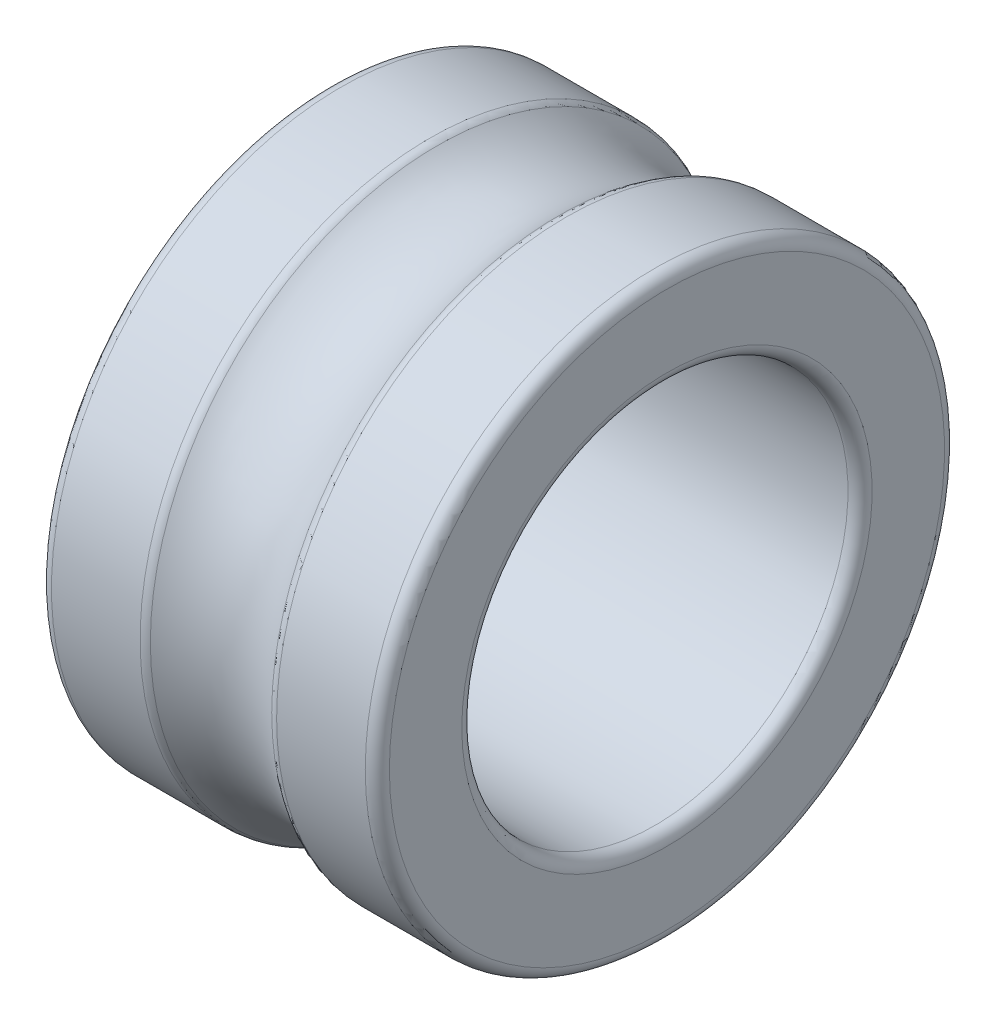
ISO-10303-21;
HEADER;
FILE_DESCRIPTION(('STEP AP214'),'2;1');
FILE_NAME('part.step','',(''),(''),'','','');
FILE_SCHEMA(('AUTOMOTIVE_DESIGN { 1 0 10303 214 1 1 1 1 }'));
ENDSEC;
DATA;
#1=APPLICATION_CONTEXT('core data for automotive mechanical design processes');
#2=APPLICATION_PROTOCOL_DEFINITION('international standard','automotive_design',2000,#1);
#3=PRODUCT_CONTEXT('',#1,'mechanical');
#4=PRODUCT('Part','Part','',(#3));
#5=PRODUCT_RELATED_PRODUCT_CATEGORY('part','',(#4));
#6=PRODUCT_DEFINITION_FORMATION('','',#4);
#7=PRODUCT_DEFINITION_CONTEXT('part definition',#1,'design');
#8=PRODUCT_DEFINITION('design','',#6,#7);
#9=PRODUCT_DEFINITION_SHAPE('','',#8);
#10=(LENGTH_UNIT() NAMED_UNIT(*) SI_UNIT(.MILLI.,.METRE.));
#11=(NAMED_UNIT(*) PLANE_ANGLE_UNIT() SI_UNIT($,.RADIAN.));
#12=(NAMED_UNIT(*) SI_UNIT($,.STERADIAN.) SOLID_ANGLE_UNIT());
#13=UNCERTAINTY_MEASURE_WITH_UNIT(LENGTH_MEASURE(1.E-05),#10,'distance_accuracy_value','');
#14=(GEOMETRIC_REPRESENTATION_CONTEXT(3) GLOBAL_UNCERTAINTY_ASSIGNED_CONTEXT((#13)) GLOBAL_UNIT_ASSIGNED_CONTEXT((#10,
#11,#12)) REPRESENTATION_CONTEXT('',''));
#15=CARTESIAN_POINT('',(0.,0.,0.));
#16=DIRECTION('',(0.,0.,1.));
#17=DIRECTION('',(1.,0.,0.));
#18=AXIS2_PLACEMENT_3D('',#15,#16,#17);
#19=CARTESIAN_POINT('',(-3.5,4.,0.));
#20=DIRECTION('',(1.,0.,0.));
#21=DIRECTION('',(0.,0.,-1.));
#22=AXIS2_PLACEMENT_3D('',#19,#20,#21);
#23=PLANE('',#22);
#24=CARTESIAN_POINT('',(-3.5,0.,0.));
#25=DIRECTION('',(1.,0.,0.));
#26=DIRECTION('',(0.,0.,-1.));
#27=AXIS2_PLACEMENT_3D('',#24,#25,#26);
#28=CIRCLE('',#27,5.75);
#29=CARTESIAN_POINT('',(-3.5,0.,-5.75));
#30=VERTEX_POINT('',#29);
#31=EDGE_CURVE('E41',#30,#30,#28,.F.);
#32=ORIENTED_EDGE('',*,*,#31,.T.);
#33=EDGE_LOOP('',(#32));
#34=FACE_BOUND('',#33,.T.);
#35=CARTESIAN_POINT('',(-3.5,0.,0.));
#36=DIRECTION('',(1.,0.,0.));
#37=DIRECTION('',(0.,0.,-1.));
#38=AXIS2_PLACEMENT_3D('',#35,#36,#37);
#39=CIRCLE('',#38,4.25);
#40=CARTESIAN_POINT('',(-3.5,0.,-4.25));
#41=VERTEX_POINT('',#40);
#42=EDGE_CURVE('E45',#41,#41,#39,.T.);
#43=ORIENTED_EDGE('',*,*,#42,.T.);
#44=EDGE_LOOP('',(#43));
#45=FACE_BOUND('',#44,.T.);
#46=ADVANCED_FACE('F31',(#34,#45),#23,.F.);
#47=CARTESIAN_POINT('',(-31.6676661264182,0.,0.));
#48=DIRECTION('',(-1.,0.,0.));
#49=DIRECTION('',(0.,0.,1.));
#50=AXIS2_PLACEMENT_3D('',#47,#48,#49);
#51=CYLINDRICAL_SURFACE('',#50,4.);
#52=CARTESIAN_POINT('',(-3.25,0.,0.));
#53=DIRECTION('',(1.,0.,0.));
#54=DIRECTION('',(0.,0.,-1.));
#55=AXIS2_PLACEMENT_3D('',#52,#53,#54);
#56=CIRCLE('',#55,4.);
#57=CARTESIAN_POINT('',(-3.25,0.,-4.));
#58=VERTEX_POINT('',#57);
#59=EDGE_CURVE('E10',#58,#58,#56,.F.);
#60=ORIENTED_EDGE('',*,*,#59,.T.);
#61=EDGE_LOOP('',(#60));
#62=FACE_BOUND('',#61,.T.);
#63=CARTESIAN_POINT('',(3.25,0.,0.));
#64=DIRECTION('',(-1.,0.,0.));
#65=DIRECTION('',(0.,0.,1.));
#66=AXIS2_PLACEMENT_3D('',#63,#64,#65);
#67=CIRCLE('',#66,4.);
#68=CARTESIAN_POINT('',(3.25,0.,4.));
#69=VERTEX_POINT('',#68);
#70=EDGE_CURVE('E37',#69,#69,#67,.F.);
#71=ORIENTED_EDGE('',*,*,#70,.T.);
#72=EDGE_LOOP('',(#71));
#73=FACE_BOUND('',#72,.T.);
#74=ADVANCED_FACE('F111',(#62,#73),#51,.F.);
#75=CARTESIAN_POINT('',(3.5,4.,0.));
#76=DIRECTION('',(-1.,0.,0.));
#77=DIRECTION('',(0.,0.,1.));
#78=AXIS2_PLACEMENT_3D('',#75,#76,#77);
#79=PLANE('',#78);
#80=CARTESIAN_POINT('',(3.5,0.,0.));
#81=DIRECTION('',(-1.,0.,0.));
#82=DIRECTION('',(0.,0.,1.));
#83=AXIS2_PLACEMENT_3D('',#80,#81,#82);
#84=CIRCLE('',#83,5.75);
#85=CARTESIAN_POINT('',(3.5,0.,5.75));
#86=VERTEX_POINT('',#85);
#87=EDGE_CURVE('E62',#86,#86,#84,.F.);
#88=ORIENTED_EDGE('',*,*,#87,.T.);
#89=EDGE_LOOP('',(#88));
#90=FACE_BOUND('',#89,.T.);
#91=CARTESIAN_POINT('',(3.5,0.,0.));
#92=DIRECTION('',(-1.,0.,0.));
#93=DIRECTION('',(0.,0.,1.));
#94=AXIS2_PLACEMENT_3D('',#91,#92,#93);
#95=CIRCLE('',#94,4.25);
#96=CARTESIAN_POINT('',(3.5,0.,4.25));
#97=VERTEX_POINT('',#96);
#98=EDGE_CURVE('E65',#97,#97,#95,.T.);
#99=ORIENTED_EDGE('',*,*,#98,.T.);
#100=EDGE_LOOP('',(#99));
#101=FACE_BOUND('',#100,.T.);
#102=ADVANCED_FACE('F129',(#90,#101),#79,.F.);
#103=CARTESIAN_POINT('',(-31.6676661264182,0.,0.));
#104=DIRECTION('',(-1.,0.,0.));
#105=DIRECTION('',(0.,0.,1.));
#106=AXIS2_PLACEMENT_3D('',#103,#104,#105);
#107=CYLINDRICAL_SURFACE('',#106,6.);
#108=CARTESIAN_POINT('',(3.25,0.,0.));
#109=DIRECTION('',(-1.,0.,0.));
#110=DIRECTION('',(0.,0.,1.));
#111=AXIS2_PLACEMENT_3D('',#108,#109,#110);
#112=CIRCLE('',#111,6.);
#113=CARTESIAN_POINT('',(3.25,0.,6.));
#114=VERTEX_POINT('',#113);
#115=EDGE_CURVE('E68',#114,#114,#112,.T.);
#116=ORIENTED_EDGE('',*,*,#115,.T.);
#117=EDGE_LOOP('',(#116));
#118=FACE_BOUND('',#117,.T.);
#119=CARTESIAN_POINT('',(1.4142135623731,0.,0.));
#120=DIRECTION('',(1.,0.,0.));
#121=DIRECTION('',(0.,0.,-1.));
#122=AXIS2_PLACEMENT_3D('',#119,#120,#121);
#123=CIRCLE('',#122,6.);
#124=CARTESIAN_POINT('',(1.4142135623731,0.,-6.));
#125=VERTEX_POINT('',#124);
#126=EDGE_CURVE('E71',#125,#125,#123,.T.);
#127=ORIENTED_EDGE('',*,*,#126,.T.);
#128=EDGE_LOOP('',(#127));
#129=FACE_BOUND('',#128,.T.);
#130=ADVANCED_FACE('F75',(#118,#129),#107,.T.);
#131=CARTESIAN_POINT('',(0.,0.,0.));
#132=DIRECTION('',(-1.,0.,0.));
#133=DIRECTION('',(0.,0.,1.));
#134=AXIS2_PLACEMENT_3D('',#131,#132,#133);
#135=TOROIDAL_SURFACE('',#134,7.5,2.);
#136=CARTESIAN_POINT('',(1.25707872210942,0.,0.));
#137=DIRECTION('',(-1.,0.,0.));
#138=DIRECTION('',(0.,0.,1.));
#139=AXIS2_PLACEMENT_3D('',#136,#137,#138);
#140=CIRCLE('',#139,5.94444444444445);
#141=CARTESIAN_POINT('',(1.25707872210942,0.,5.94444444444445));
#142=VERTEX_POINT('',#141);
#143=EDGE_CURVE('E56',#142,#142,#140,.T.);
#144=ORIENTED_EDGE('',*,*,#143,.T.);
#145=EDGE_LOOP('',(#144));
#146=FACE_BOUND('',#145,.T.);
#147=CARTESIAN_POINT('',(-1.25707872210942,0.,0.));
#148=DIRECTION('',(1.,0.,0.));
#149=DIRECTION('',(0.,0.,-1.));
#150=AXIS2_PLACEMENT_3D('',#147,#148,#149);
#151=CIRCLE('',#150,5.94444444444444);
#152=CARTESIAN_POINT('',(-1.25707872210942,0.,-5.94444444444444));
#153=VERTEX_POINT('',#152);
#154=EDGE_CURVE('E59',#153,#153,#151,.T.);
#155=ORIENTED_EDGE('',*,*,#154,.T.);
#156=EDGE_LOOP('',(#155));
#157=FACE_BOUND('',#156,.T.);
#158=ADVANCED_FACE('F85',(#146,#157),#135,.F.);
#159=CARTESIAN_POINT('',(-31.6676661264182,0.,0.));
#160=DIRECTION('',(-1.,0.,0.));
#161=DIRECTION('',(0.,0.,1.));
#162=AXIS2_PLACEMENT_3D('',#159,#160,#161);
#163=CYLINDRICAL_SURFACE('',#162,6.);
#164=CARTESIAN_POINT('',(-1.41421356237309,0.,0.));
#165=DIRECTION('',(1.,0.,0.));
#166=DIRECTION('',(0.,0.,-1.));
#167=AXIS2_PLACEMENT_3D('',#164,#165,#166);
#168=CIRCLE('',#167,6.);
#169=CARTESIAN_POINT('',(-1.41421356237309,0.,-6.));
#170=VERTEX_POINT('',#169);
#171=EDGE_CURVE('E50',#170,#170,#168,.F.);
#172=ORIENTED_EDGE('',*,*,#171,.T.);
#173=EDGE_LOOP('',(#172));
#174=FACE_BOUND('',#173,.T.);
#175=CARTESIAN_POINT('',(-3.25,0.,0.));
#176=DIRECTION('',(1.,0.,0.));
#177=DIRECTION('',(0.,0.,-1.));
#178=AXIS2_PLACEMENT_3D('',#175,#176,#177);
#179=CIRCLE('',#178,6.);
#180=CARTESIAN_POINT('',(-3.25,0.,-6.));
#181=VERTEX_POINT('',#180);
#182=EDGE_CURVE('E53',#181,#181,#179,.T.);
#183=ORIENTED_EDGE('',*,*,#182,.T.);
#184=EDGE_LOOP('',(#183));
#185=FACE_BOUND('',#184,.T.);
#186=ADVANCED_FACE('F88',(#174,#185),#163,.T.);
#187=CARTESIAN_POINT('',(3.25,0.,0.));
#188=DIRECTION('',(-1.,0.,0.));
#189=DIRECTION('',(0.,0.,1.));
#190=AXIS2_PLACEMENT_3D('',#187,#188,#189);
#191=TOROIDAL_SURFACE('',#190,5.75,0.25);
#192=ORIENTED_EDGE('',*,*,#87,.F.);
#193=EDGE_LOOP('',(#192));
#194=FACE_BOUND('',#193,.T.);
#195=ORIENTED_EDGE('',*,*,#115,.F.);
#196=EDGE_LOOP('',(#195));
#197=FACE_BOUND('',#196,.T.);
#198=ADVANCED_FACE('F81',(#194,#197),#191,.T.);
#199=CARTESIAN_POINT('',(1.4142135623731,0.,0.));
#200=DIRECTION('',(1.,0.,0.));
#201=DIRECTION('',(0.,0.,-1.));
#202=AXIS2_PLACEMENT_3D('',#199,#200,#201);
#203=TOROIDAL_SURFACE('',#202,5.75,0.25);
#204=ORIENTED_EDGE('',*,*,#126,.F.);
#205=EDGE_LOOP('',(#204));
#206=FACE_BOUND('',#205,.T.);
#207=ORIENTED_EDGE('',*,*,#143,.F.);
#208=EDGE_LOOP('',(#207));
#209=FACE_BOUND('',#208,.T.);
#210=ADVANCED_FACE('F77',(#206,#209),#203,.T.);
#211=CARTESIAN_POINT('',(-1.41421356237309,0.,0.));
#212=DIRECTION('',(1.,0.,0.));
#213=DIRECTION('',(0.,0.,-1.));
#214=AXIS2_PLACEMENT_3D('',#211,#212,#213);
#215=TOROIDAL_SURFACE('',#214,5.75,0.25);
#216=ORIENTED_EDGE('',*,*,#154,.F.);
#217=EDGE_LOOP('',(#216));
#218=FACE_BOUND('',#217,.T.);
#219=ORIENTED_EDGE('',*,*,#171,.F.);
#220=EDGE_LOOP('',(#219));
#221=FACE_BOUND('',#220,.T.);
#222=ADVANCED_FACE('F80',(#218,#221),#215,.T.);
#223=CARTESIAN_POINT('',(-3.25,0.,0.));
#224=DIRECTION('',(1.,0.,0.));
#225=DIRECTION('',(0.,0.,-1.));
#226=AXIS2_PLACEMENT_3D('',#223,#224,#225);
#227=TOROIDAL_SURFACE('',#226,5.75,0.25);
#228=ORIENTED_EDGE('',*,*,#182,.F.);
#229=EDGE_LOOP('',(#228));
#230=FACE_BOUND('',#229,.T.);
#231=ORIENTED_EDGE('',*,*,#31,.F.);
#232=EDGE_LOOP('',(#231));
#233=FACE_BOUND('',#232,.T.);
#234=ADVANCED_FACE('F94',(#230,#233),#227,.T.);
#235=CARTESIAN_POINT('',(-3.25,0.,0.));
#236=DIRECTION('',(1.,0.,0.));
#237=DIRECTION('',(0.,0.,-1.));
#238=AXIS2_PLACEMENT_3D('',#235,#236,#237);
#239=TOROIDAL_SURFACE('',#238,4.25,0.25);
#240=ORIENTED_EDGE('',*,*,#42,.F.);
#241=EDGE_LOOP('',(#240));
#242=FACE_BOUND('',#241,.T.);
#243=ORIENTED_EDGE('',*,*,#59,.F.);
#244=EDGE_LOOP('',(#243));
#245=FACE_BOUND('',#244,.T.);
#246=ADVANCED_FACE('F105',(#242,#245),#239,.T.);
#247=CARTESIAN_POINT('',(3.25,0.,0.));
#248=DIRECTION('',(-1.,0.,0.));
#249=DIRECTION('',(0.,0.,1.));
#250=AXIS2_PLACEMENT_3D('',#247,#248,#249);
#251=TOROIDAL_SURFACE('',#250,4.25,0.25);
#252=ORIENTED_EDGE('',*,*,#70,.F.);
#253=EDGE_LOOP('',(#252));
#254=FACE_BOUND('',#253,.T.);
#255=ORIENTED_EDGE('',*,*,#98,.F.);
#256=EDGE_LOOP('',(#255));
#257=FACE_BOUND('',#256,.T.);
#258=ADVANCED_FACE('F116',(#254,#257),#251,.T.);
#259=CLOSED_SHELL('',(#46,#74,#102,#130,#158,#186,#198,#210,#222,#234,#246,#258));
#260=MANIFOLD_SOLID_BREP('B2',#259);
#261=ADVANCED_BREP_SHAPE_REPRESENTATION('',(#18,#260),#14);
#262=SHAPE_DEFINITION_REPRESENTATION(#9,#261);
ENDSEC;
END-ISO-10303-21;
